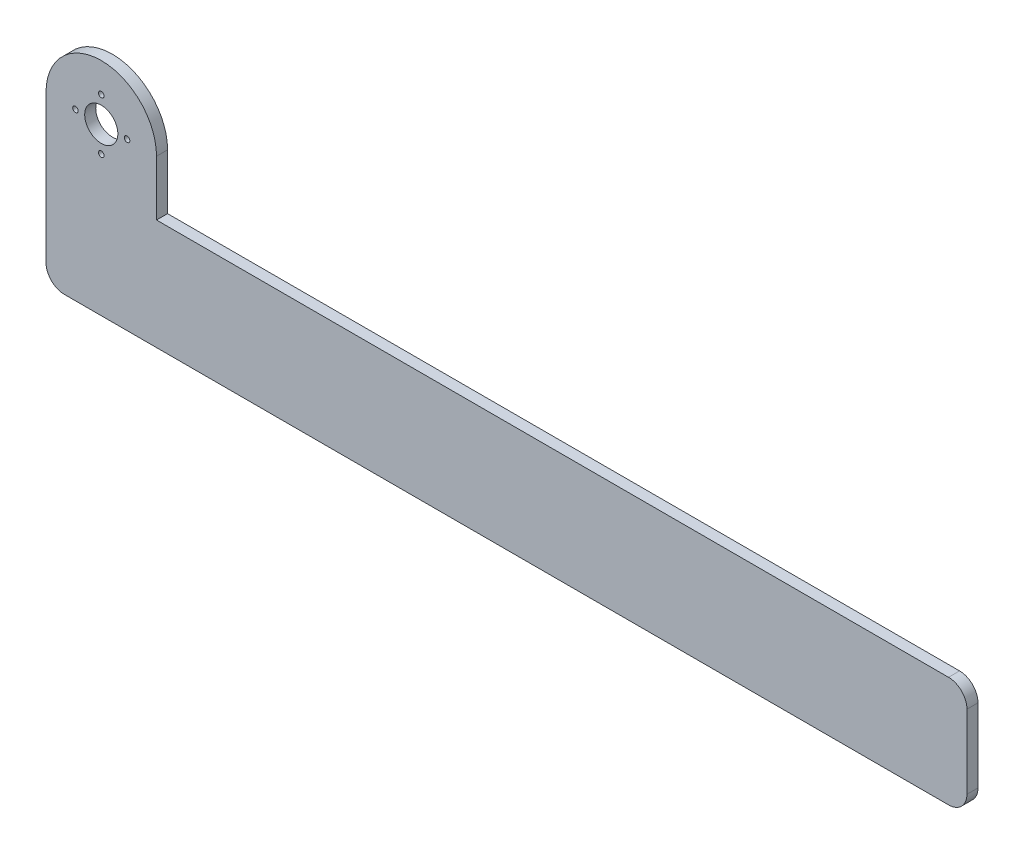
ISO-10303-21;
HEADER;
FILE_DESCRIPTION(('STEP AP214'),'2;1');
FILE_NAME('part.step','',(''),(''),'','','');
FILE_SCHEMA(('AUTOMOTIVE_DESIGN { 1 0 10303 214 1 1 1 1 }'));
ENDSEC;
DATA;
#1=APPLICATION_CONTEXT('core data for automotive mechanical design processes');
#2=APPLICATION_PROTOCOL_DEFINITION('international standard','automotive_design',2000,#1);
#3=PRODUCT_CONTEXT('',#1,'mechanical');
#4=PRODUCT('Part','Part','',(#3));
#5=PRODUCT_RELATED_PRODUCT_CATEGORY('part','',(#4));
#6=PRODUCT_DEFINITION_FORMATION('','',#4);
#7=PRODUCT_DEFINITION_CONTEXT('part definition',#1,'design');
#8=PRODUCT_DEFINITION('design','',#6,#7);
#9=PRODUCT_DEFINITION_SHAPE('','',#8);
#10=(LENGTH_UNIT() NAMED_UNIT(*) SI_UNIT(.MILLI.,.METRE.));
#11=(NAMED_UNIT(*) PLANE_ANGLE_UNIT() SI_UNIT($,.RADIAN.));
#12=(NAMED_UNIT(*) SI_UNIT($,.STERADIAN.) SOLID_ANGLE_UNIT());
#13=UNCERTAINTY_MEASURE_WITH_UNIT(LENGTH_MEASURE(1.E-05),#10,'distance_accuracy_value','');
#14=(GEOMETRIC_REPRESENTATION_CONTEXT(3) GLOBAL_UNCERTAINTY_ASSIGNED_CONTEXT((#13)) GLOBAL_UNIT_ASSIGNED_CONTEXT((#10,
#11,#12)) REPRESENTATION_CONTEXT('',''));
#15=CARTESIAN_POINT('',(0.,0.,0.));
#16=DIRECTION('',(0.,0.,1.));
#17=DIRECTION('',(1.,0.,0.));
#18=AXIS2_PLACEMENT_3D('',#15,#16,#17);
#19=CARTESIAN_POINT('',(-30.,45.,-6.));
#20=DIRECTION('',(-1.,0.,0.));
#21=DIRECTION('',(0.,-1.,0.));
#22=AXIS2_PLACEMENT_3D('',#19,#20,#21);
#23=PLANE('',#22);
#24=DIRECTION('',(0.,-1.,0.));
#25=VECTOR('',#24,1.);
#26=CARTESIAN_POINT('',(-30.,45.,-6.));
#27=LINE('',#26,#25);
#28=CARTESIAN_POINT('',(-30.,45.,-6.));
#29=VERTEX_POINT('',#28);
#30=CARTESIAN_POINT('',(-30.,-35.,-6.));
#31=VERTEX_POINT('',#30);
#32=EDGE_CURVE('E121',#29,#31,#27,.T.);
#33=ORIENTED_EDGE('',*,*,#32,.T.);
#34=DIRECTION('',(0.,0.,1.));
#35=VECTOR('',#34,1.);
#36=CARTESIAN_POINT('',(-30.,-35.,-6.));
#37=LINE('',#36,#35);
#38=CARTESIAN_POINT('',(-30.,-35.,0.));
#39=VERTEX_POINT('',#38);
#40=EDGE_CURVE('E153',#31,#39,#37,.T.);
#41=ORIENTED_EDGE('',*,*,#40,.T.);
#42=DIRECTION('',(0.,-1.,0.));
#43=VECTOR('',#42,1.);
#44=CARTESIAN_POINT('',(-30.,45.,0.));
#45=LINE('',#44,#43);
#46=CARTESIAN_POINT('',(-30.,45.,0.));
#47=VERTEX_POINT('',#46);
#48=EDGE_CURVE('E147',#47,#39,#45,.T.);
#49=ORIENTED_EDGE('',*,*,#48,.F.);
#50=DIRECTION('',(0.,0.,1.));
#51=VECTOR('',#50,1.);
#52=CARTESIAN_POINT('',(-30.,45.,-6.));
#53=LINE('',#52,#51);
#54=EDGE_CURVE('E151',#29,#47,#53,.T.);
#55=ORIENTED_EDGE('',*,*,#54,.F.);
#56=EDGE_LOOP('',(#33,#41,#49,#55));
#57=FACE_BOUND('',#56,.T.);
#58=ADVANCED_FACE('F37',(#57),#23,.T.);
#59=CARTESIAN_POINT('',(0.,45.,-6.));
#60=DIRECTION('',(0.,0.,1.));
#61=DIRECTION('',(1.,0.,0.));
#62=AXIS2_PLACEMENT_3D('',#59,#60,#61);
#63=CYLINDRICAL_SURFACE('',#62,30.);
#64=CARTESIAN_POINT('',(0.,45.,0.));
#65=DIRECTION('',(0.,0.,1.));
#66=DIRECTION('',(-1.,0.,0.));
#67=AXIS2_PLACEMENT_3D('',#64,#65,#66);
#68=CIRCLE('',#67,30.);
#69=CARTESIAN_POINT('',(30.,45.,0.));
#70=VERTEX_POINT('',#69);
#71=EDGE_CURVE('E144',#70,#47,#68,.T.);
#72=ORIENTED_EDGE('',*,*,#71,.F.);
#73=DIRECTION('',(0.,0.,1.));
#74=VECTOR('',#73,1.);
#75=CARTESIAN_POINT('',(30.,45.,-6.));
#76=LINE('',#75,#74);
#77=CARTESIAN_POINT('',(30.,45.,-6.));
#78=VERTEX_POINT('',#77);
#79=EDGE_CURVE('E120',#78,#70,#76,.T.);
#80=ORIENTED_EDGE('',*,*,#79,.F.);
#81=CARTESIAN_POINT('',(0.,45.,-6.));
#82=DIRECTION('',(0.,0.,1.));
#83=DIRECTION('',(-1.,0.,0.));
#84=AXIS2_PLACEMENT_3D('',#81,#82,#83);
#85=CIRCLE('',#84,30.);
#86=EDGE_CURVE('E127',#78,#29,#85,.T.);
#87=ORIENTED_EDGE('',*,*,#86,.T.);
#88=ORIENTED_EDGE('',*,*,#54,.T.);
#89=EDGE_LOOP('',(#72,#80,#87,#88));
#90=FACE_BOUND('',#89,.T.);
#91=ADVANCED_FACE('F212',(#90),#63,.T.);
#92=CARTESIAN_POINT('',(30.,45.,-6.));
#93=DIRECTION('',(1.,0.,0.));
#94=DIRECTION('',(0.,1.,0.));
#95=AXIS2_PLACEMENT_3D('',#92,#93,#94);
#96=PLANE('',#95);
#97=DIRECTION('',(0.,1.,0.));
#98=VECTOR('',#97,1.);
#99=CARTESIAN_POINT('',(30.,45.,0.));
#100=LINE('',#99,#98);
#101=CARTESIAN_POINT('',(30.,15.,0.));
#102=VERTEX_POINT('',#101);
#103=EDGE_CURVE('E119',#102,#70,#100,.T.);
#104=ORIENTED_EDGE('',*,*,#103,.F.);
#105=DIRECTION('',(0.,0.,1.));
#106=VECTOR('',#105,1.);
#107=CARTESIAN_POINT('',(30.,15.,-6.));
#108=LINE('',#107,#106);
#109=CARTESIAN_POINT('',(30.,15.,-6.));
#110=VERTEX_POINT('',#109);
#111=EDGE_CURVE('E109',#110,#102,#108,.T.);
#112=ORIENTED_EDGE('',*,*,#111,.F.);
#113=DIRECTION('',(0.,1.,0.));
#114=VECTOR('',#113,1.);
#115=CARTESIAN_POINT('',(30.,45.,-6.));
#116=LINE('',#115,#114);
#117=EDGE_CURVE('E112',#110,#78,#116,.T.);
#118=ORIENTED_EDGE('',*,*,#117,.T.);
#119=ORIENTED_EDGE('',*,*,#79,.T.);
#120=EDGE_LOOP('',(#104,#112,#118,#119));
#121=FACE_BOUND('',#120,.T.);
#122=ADVANCED_FACE('F117',(#121),#96,.T.);
#123=CARTESIAN_POINT('',(470.,15.,-6.));
#124=DIRECTION('',(0.,1.,0.));
#125=DIRECTION('',(-1.,0.,0.));
#126=AXIS2_PLACEMENT_3D('',#123,#124,#125);
#127=PLANE('',#126);
#128=DIRECTION('',(-1.,0.,0.));
#129=VECTOR('',#128,1.);
#130=CARTESIAN_POINT('',(470.,15.,0.));
#131=LINE('',#130,#129);
#132=CARTESIAN_POINT('',(460.,15.,0.));
#133=VERTEX_POINT('',#132);
#134=EDGE_CURVE('E141',#133,#102,#131,.T.);
#135=ORIENTED_EDGE('',*,*,#134,.F.);
#136=DIRECTION('',(0.,0.,1.));
#137=VECTOR('',#136,1.);
#138=CARTESIAN_POINT('',(460.,15.,-6.));
#139=LINE('',#138,#137);
#140=CARTESIAN_POINT('',(460.,15.,-6.));
#141=VERTEX_POINT('',#140);
#142=EDGE_CURVE('E11',#133,#141,#139,.F.);
#143=ORIENTED_EDGE('',*,*,#142,.T.);
#144=DIRECTION('',(-1.,0.,0.));
#145=VECTOR('',#144,1.);
#146=CARTESIAN_POINT('',(470.,15.,-6.));
#147=LINE('',#146,#145);
#148=EDGE_CURVE('E106',#141,#110,#147,.T.);
#149=ORIENTED_EDGE('',*,*,#148,.T.);
#150=ORIENTED_EDGE('',*,*,#111,.T.);
#151=EDGE_LOOP('',(#135,#143,#149,#150));
#152=FACE_BOUND('',#151,.T.);
#153=ADVANCED_FACE('F108',(#152),#127,.T.);
#154=CARTESIAN_POINT('',(470.,-45.,-6.));
#155=DIRECTION('',(1.,0.,0.));
#156=DIRECTION('',(0.,0.,-1.));
#157=AXIS2_PLACEMENT_3D('',#154,#155,#156);
#158=PLANE('',#157);
#159=DIRECTION('',(0.,1.,0.));
#160=VECTOR('',#159,1.);
#161=CARTESIAN_POINT('',(470.,-45.,0.));
#162=LINE('',#161,#160);
#163=CARTESIAN_POINT('',(470.,-35.,0.));
#164=VERTEX_POINT('',#163);
#165=CARTESIAN_POINT('',(470.,5.00000000000002,0.));
#166=VERTEX_POINT('',#165);
#167=EDGE_CURVE('E137',#164,#166,#162,.T.);
#168=ORIENTED_EDGE('',*,*,#167,.F.);
#169=DIRECTION('',(0.,0.,1.));
#170=VECTOR('',#169,1.);
#171=CARTESIAN_POINT('',(470.,-35.,-6.));
#172=LINE('',#171,#170);
#173=CARTESIAN_POINT('',(470.,-35.,-6.));
#174=VERTEX_POINT('',#173);
#175=EDGE_CURVE('E173',#164,#174,#172,.F.);
#176=ORIENTED_EDGE('',*,*,#175,.T.);
#177=DIRECTION('',(0.,1.,0.));
#178=VECTOR('',#177,1.);
#179=CARTESIAN_POINT('',(470.,-45.,-6.));
#180=LINE('',#179,#178);
#181=CARTESIAN_POINT('',(470.,5.00000000000002,-6.));
#182=VERTEX_POINT('',#181);
#183=EDGE_CURVE('E113',#174,#182,#180,.T.);
#184=ORIENTED_EDGE('',*,*,#183,.T.);
#185=DIRECTION('',(0.,0.,1.));
#186=VECTOR('',#185,1.);
#187=CARTESIAN_POINT('',(470.,5.00000000000002,-6.));
#188=LINE('',#187,#186);
#189=EDGE_CURVE('E170',#182,#166,#188,.T.);
#190=ORIENTED_EDGE('',*,*,#189,.T.);
#191=EDGE_LOOP('',(#168,#176,#184,#190));
#192=FACE_BOUND('',#191,.T.);
#193=ADVANCED_FACE('F192',(#192),#158,.T.);
#194=CARTESIAN_POINT('',(30.,-45.,-6.));
#195=DIRECTION('',(0.,-1.,0.));
#196=DIRECTION('',(1.,0.,0.));
#197=AXIS2_PLACEMENT_3D('',#194,#195,#196);
#198=PLANE('',#197);
#199=DIRECTION('',(1.,0.,0.));
#200=VECTOR('',#199,1.);
#201=CARTESIAN_POINT('',(-30.,-45.,-6.));
#202=LINE('',#201,#200);
#203=CARTESIAN_POINT('',(-20.,-45.,-6.));
#204=VERTEX_POINT('',#203);
#205=CARTESIAN_POINT('',(460.,-45.0000000000001,-6.));
#206=VERTEX_POINT('',#205);
#207=EDGE_CURVE('E150',#204,#206,#202,.T.);
#208=ORIENTED_EDGE('',*,*,#207,.T.);
#209=DIRECTION('',(0.,0.,1.));
#210=VECTOR('',#209,1.);
#211=CARTESIAN_POINT('',(460.,-45.,-6.));
#212=LINE('',#211,#210);
#213=CARTESIAN_POINT('',(460.,-45.,0.));
#214=VERTEX_POINT('',#213);
#215=EDGE_CURVE('E163',#206,#214,#212,.T.);
#216=ORIENTED_EDGE('',*,*,#215,.T.);
#217=DIRECTION('',(1.,0.,0.));
#218=VECTOR('',#217,1.);
#219=CARTESIAN_POINT('',(30.,-45.,0.));
#220=LINE('',#219,#218);
#221=CARTESIAN_POINT('',(-20.,-45.,0.));
#222=VERTEX_POINT('',#221);
#223=EDGE_CURVE('E134',#222,#214,#220,.T.);
#224=ORIENTED_EDGE('',*,*,#223,.F.);
#225=DIRECTION('',(0.,0.,1.));
#226=VECTOR('',#225,1.);
#227=CARTESIAN_POINT('',(-20.,-45.,-6.));
#228=LINE('',#227,#226);
#229=EDGE_CURVE('E159',#222,#204,#228,.F.);
#230=ORIENTED_EDGE('',*,*,#229,.T.);
#231=EDGE_LOOP('',(#208,#216,#224,#230));
#232=FACE_BOUND('',#231,.T.);
#233=ADVANCED_FACE('F183',(#232),#198,.T.);
#234=CARTESIAN_POINT('',(0.,45.,-6.));
#235=DIRECTION('',(0.,0.,-1.));
#236=DIRECTION('',(-1.,0.,0.));
#237=AXIS2_PLACEMENT_3D('',#234,#235,#236);
#238=PLANE('',#237);
#239=CARTESIAN_POINT('',(0.,31.,-6.));
#240=DIRECTION('',(0.,0.,-1.));
#241=DIRECTION('',(-1.,0.,0.));
#242=AXIS2_PLACEMENT_3D('',#239,#240,#241);
#243=CIRCLE('',#242,1.5);
#244=CARTESIAN_POINT('',(-1.5,31.,-6.));
#245=VERTEX_POINT('',#244);
#246=EDGE_CURVE('E261',#245,#245,#243,.T.);
#247=ORIENTED_EDGE('',*,*,#246,.F.);
#248=EDGE_LOOP('',(#247));
#249=FACE_BOUND('',#248,.T.);
#250=CARTESIAN_POINT('',(-14.,45.,-6.));
#251=DIRECTION('',(0.,0.,-1.));
#252=DIRECTION('',(-1.,0.,0.));
#253=AXIS2_PLACEMENT_3D('',#250,#251,#252);
#254=CIRCLE('',#253,1.5);
#255=CARTESIAN_POINT('',(-15.5,45.,-6.));
#256=VERTEX_POINT('',#255);
#257=EDGE_CURVE('E262',#256,#256,#254,.T.);
#258=ORIENTED_EDGE('',*,*,#257,.F.);
#259=EDGE_LOOP('',(#258));
#260=FACE_BOUND('',#259,.T.);
#261=CARTESIAN_POINT('',(0.,59.,-6.));
#262=DIRECTION('',(0.,0.,-1.));
#263=DIRECTION('',(-1.,0.,0.));
#264=AXIS2_PLACEMENT_3D('',#261,#262,#263);
#265=CIRCLE('',#264,1.5);
#266=CARTESIAN_POINT('',(-1.5,59.,-6.));
#267=VERTEX_POINT('',#266);
#268=EDGE_CURVE('E272',#267,#267,#265,.T.);
#269=ORIENTED_EDGE('',*,*,#268,.F.);
#270=EDGE_LOOP('',(#269));
#271=FACE_BOUND('',#270,.T.);
#272=CARTESIAN_POINT('',(14.,45.,-6.));
#273=DIRECTION('',(0.,0.,-1.));
#274=DIRECTION('',(-1.,0.,0.));
#275=AXIS2_PLACEMENT_3D('',#272,#273,#274);
#276=CIRCLE('',#275,1.5);
#277=CARTESIAN_POINT('',(12.5,45.,-6.));
#278=VERTEX_POINT('',#277);
#279=EDGE_CURVE('E278',#278,#278,#276,.T.);
#280=ORIENTED_EDGE('',*,*,#279,.F.);
#281=EDGE_LOOP('',(#280));
#282=FACE_BOUND('',#281,.T.);
#283=CARTESIAN_POINT('',(0.,45.,-6.));
#284=DIRECTION('',(0.,0.,-1.));
#285=DIRECTION('',(-1.,0.,0.));
#286=AXIS2_PLACEMENT_3D('',#283,#284,#285);
#287=CIRCLE('',#286,9.);
#288=CARTESIAN_POINT('',(-8.99999999999999,45.,-6.));
#289=VERTEX_POINT('',#288);
#290=EDGE_CURVE('E264',#289,#289,#287,.T.);
#291=ORIENTED_EDGE('',*,*,#290,.F.);
#292=EDGE_LOOP('',(#291));
#293=FACE_BOUND('',#292,.T.);
#294=ORIENTED_EDGE('',*,*,#183,.F.);
#295=CARTESIAN_POINT('',(460.,-35.,-6.));
#296=DIRECTION('',(0.,0.,-1.));
#297=DIRECTION('',(-1.,0.,0.));
#298=AXIS2_PLACEMENT_3D('',#295,#296,#297);
#299=CIRCLE('',#298,10.);
#300=EDGE_CURVE('E45',#174,#206,#299,.T.);
#301=ORIENTED_EDGE('',*,*,#300,.T.);
#302=ORIENTED_EDGE('',*,*,#207,.F.);
#303=CARTESIAN_POINT('',(-20.,-35.,-6.));
#304=DIRECTION('',(0.,0.,-1.));
#305=DIRECTION('',(-1.,0.,0.));
#306=AXIS2_PLACEMENT_3D('',#303,#304,#305);
#307=CIRCLE('',#306,10.);
#308=EDGE_CURVE('E161',#204,#31,#307,.T.);
#309=ORIENTED_EDGE('',*,*,#308,.T.);
#310=ORIENTED_EDGE('',*,*,#32,.F.);
#311=ORIENTED_EDGE('',*,*,#86,.F.);
#312=ORIENTED_EDGE('',*,*,#117,.F.);
#313=ORIENTED_EDGE('',*,*,#148,.F.);
#314=CARTESIAN_POINT('',(460.,5.00000000000002,-6.));
#315=DIRECTION('',(0.,0.,-1.));
#316=DIRECTION('',(-1.,0.,0.));
#317=AXIS2_PLACEMENT_3D('',#314,#315,#316);
#318=CIRCLE('',#317,10.);
#319=EDGE_CURVE('E57',#141,#182,#318,.T.);
#320=ORIENTED_EDGE('',*,*,#319,.T.);
#321=EDGE_LOOP('',(#294,#301,#302,#309,#310,#311,#312,#313,#320));
#322=FACE_BOUND('',#321,.T.);
#323=ADVANCED_FACE('F124',(#249,#260,#271,#282,#293,#322),#238,.T.);
#324=CARTESIAN_POINT('',(0.,45.,0.));
#325=DIRECTION('',(0.,0.,-1.));
#326=DIRECTION('',(-1.,0.,0.));
#327=AXIS2_PLACEMENT_3D('',#324,#325,#326);
#328=PLANE('',#327);
#329=CARTESIAN_POINT('',(0.,31.,0.));
#330=DIRECTION('',(0.,0.,-1.));
#331=DIRECTION('',(-1.,0.,0.));
#332=AXIS2_PLACEMENT_3D('',#329,#330,#331);
#333=CIRCLE('',#332,1.5);
#334=CARTESIAN_POINT('',(-1.5,31.,0.));
#335=VERTEX_POINT('',#334);
#336=EDGE_CURVE('E259',#335,#335,#333,.T.);
#337=ORIENTED_EDGE('',*,*,#336,.T.);
#338=EDGE_LOOP('',(#337));
#339=FACE_BOUND('',#338,.T.);
#340=CARTESIAN_POINT('',(-14.,45.,0.));
#341=DIRECTION('',(0.,0.,-1.));
#342=DIRECTION('',(-1.,0.,0.));
#343=AXIS2_PLACEMENT_3D('',#340,#341,#342);
#344=CIRCLE('',#343,1.5);
#345=CARTESIAN_POINT('',(-15.5,45.,0.));
#346=VERTEX_POINT('',#345);
#347=EDGE_CURVE('E267',#346,#346,#344,.T.);
#348=ORIENTED_EDGE('',*,*,#347,.T.);
#349=EDGE_LOOP('',(#348));
#350=FACE_BOUND('',#349,.T.);
#351=CARTESIAN_POINT('',(0.,59.,0.));
#352=DIRECTION('',(0.,0.,-1.));
#353=DIRECTION('',(-1.,0.,0.));
#354=AXIS2_PLACEMENT_3D('',#351,#352,#353);
#355=CIRCLE('',#354,1.5);
#356=CARTESIAN_POINT('',(-1.5,59.,0.));
#357=VERTEX_POINT('',#356);
#358=EDGE_CURVE('E275',#357,#357,#355,.T.);
#359=ORIENTED_EDGE('',*,*,#358,.T.);
#360=EDGE_LOOP('',(#359));
#361=FACE_BOUND('',#360,.T.);
#362=CARTESIAN_POINT('',(14.,45.,0.));
#363=DIRECTION('',(0.,0.,-1.));
#364=DIRECTION('',(-1.,0.,0.));
#365=AXIS2_PLACEMENT_3D('',#362,#363,#364);
#366=CIRCLE('',#365,1.5);
#367=CARTESIAN_POINT('',(12.5,45.,0.));
#368=VERTEX_POINT('',#367);
#369=EDGE_CURVE('E281',#368,#368,#366,.T.);
#370=ORIENTED_EDGE('',*,*,#369,.T.);
#371=EDGE_LOOP('',(#370));
#372=FACE_BOUND('',#371,.T.);
#373=CARTESIAN_POINT('',(0.,45.,0.));
#374=DIRECTION('',(0.,0.,-1.));
#375=DIRECTION('',(-1.,0.,0.));
#376=AXIS2_PLACEMENT_3D('',#373,#374,#375);
#377=CIRCLE('',#376,9.);
#378=CARTESIAN_POINT('',(-8.99999999999999,45.,0.));
#379=VERTEX_POINT('',#378);
#380=EDGE_CURVE('E138',#379,#379,#377,.T.);
#381=ORIENTED_EDGE('',*,*,#380,.T.);
#382=EDGE_LOOP('',(#381));
#383=FACE_BOUND('',#382,.T.);
#384=ORIENTED_EDGE('',*,*,#223,.T.);
#385=CARTESIAN_POINT('',(460.,-35.,0.));
#386=DIRECTION('',(0.,0.,-1.));
#387=DIRECTION('',(-1.,0.,0.));
#388=AXIS2_PLACEMENT_3D('',#385,#386,#387);
#389=CIRCLE('',#388,10.);
#390=EDGE_CURVE('E168',#214,#164,#389,.F.);
#391=ORIENTED_EDGE('',*,*,#390,.T.);
#392=ORIENTED_EDGE('',*,*,#167,.T.);
#393=CARTESIAN_POINT('',(460.,5.00000000000002,0.));
#394=DIRECTION('',(0.,0.,-1.));
#395=DIRECTION('',(-1.,0.,0.));
#396=AXIS2_PLACEMENT_3D('',#393,#394,#395);
#397=CIRCLE('',#396,10.);
#398=EDGE_CURVE('E166',#166,#133,#397,.F.);
#399=ORIENTED_EDGE('',*,*,#398,.T.);
#400=ORIENTED_EDGE('',*,*,#134,.T.);
#401=ORIENTED_EDGE('',*,*,#103,.T.);
#402=ORIENTED_EDGE('',*,*,#71,.T.);
#403=ORIENTED_EDGE('',*,*,#48,.T.);
#404=CARTESIAN_POINT('',(-20.,-35.,0.));
#405=DIRECTION('',(0.,0.,-1.));
#406=DIRECTION('',(-1.,0.,0.));
#407=AXIS2_PLACEMENT_3D('',#404,#405,#406);
#408=CIRCLE('',#407,10.);
#409=EDGE_CURVE('E157',#39,#222,#408,.F.);
#410=ORIENTED_EDGE('',*,*,#409,.T.);
#411=EDGE_LOOP('',(#384,#391,#392,#399,#400,#401,#402,#403,#410));
#412=FACE_BOUND('',#411,.T.);
#413=ADVANCED_FACE('F190',(#339,#350,#361,#372,#383,#412),#328,.F.);
#414=CARTESIAN_POINT('',(-20.,-35.,-6.));
#415=DIRECTION('',(0.,0.,1.));
#416=DIRECTION('',(1.,0.,0.));
#417=AXIS2_PLACEMENT_3D('',#414,#415,#416);
#418=CYLINDRICAL_SURFACE('',#417,10.);
#419=ORIENTED_EDGE('',*,*,#308,.F.);
#420=ORIENTED_EDGE('',*,*,#229,.F.);
#421=ORIENTED_EDGE('',*,*,#409,.F.);
#422=ORIENTED_EDGE('',*,*,#40,.F.);
#423=EDGE_LOOP('',(#419,#420,#421,#422));
#424=FACE_BOUND('',#423,.T.);
#425=ADVANCED_FACE('F201',(#424),#418,.T.);
#426=CARTESIAN_POINT('',(460.,-35.,-6.));
#427=DIRECTION('',(0.,0.,1.));
#428=DIRECTION('',(1.,0.,0.));
#429=AXIS2_PLACEMENT_3D('',#426,#427,#428);
#430=CYLINDRICAL_SURFACE('',#429,10.);
#431=ORIENTED_EDGE('',*,*,#300,.F.);
#432=ORIENTED_EDGE('',*,*,#175,.F.);
#433=ORIENTED_EDGE('',*,*,#390,.F.);
#434=ORIENTED_EDGE('',*,*,#215,.F.);
#435=EDGE_LOOP('',(#431,#432,#433,#434));
#436=FACE_BOUND('',#435,.T.);
#437=ADVANCED_FACE('F187',(#436),#430,.T.);
#438=CARTESIAN_POINT('',(460.,5.00000000000002,-6.));
#439=DIRECTION('',(0.,0.,1.));
#440=DIRECTION('',(1.,0.,0.));
#441=AXIS2_PLACEMENT_3D('',#438,#439,#440);
#442=CYLINDRICAL_SURFACE('',#441,10.);
#443=ORIENTED_EDGE('',*,*,#319,.F.);
#444=ORIENTED_EDGE('',*,*,#142,.F.);
#445=ORIENTED_EDGE('',*,*,#398,.F.);
#446=ORIENTED_EDGE('',*,*,#189,.F.);
#447=EDGE_LOOP('',(#443,#444,#445,#446));
#448=FACE_BOUND('',#447,.T.);
#449=ADVANCED_FACE('F39',(#448),#442,.T.);
#450=CARTESIAN_POINT('',(0.,45.,0.));
#451=DIRECTION('',(0.,0.,-1.));
#452=DIRECTION('',(-1.,0.,0.));
#453=AXIS2_PLACEMENT_3D('',#450,#451,#452);
#454=CYLINDRICAL_SURFACE('',#453,9.);
#455=ORIENTED_EDGE('',*,*,#380,.F.);
#456=EDGE_LOOP('',(#455));
#457=FACE_BOUND('',#456,.T.);
#458=ORIENTED_EDGE('',*,*,#290,.T.);
#459=EDGE_LOOP('',(#458));
#460=FACE_BOUND('',#459,.T.);
#461=ADVANCED_FACE('F235',(#457,#460),#454,.F.);
#462=CARTESIAN_POINT('',(14.,45.,0.));
#463=DIRECTION('',(0.,0.,-1.));
#464=DIRECTION('',(-1.,0.,0.));
#465=AXIS2_PLACEMENT_3D('',#462,#463,#464);
#466=CYLINDRICAL_SURFACE('',#465,1.5);
#467=ORIENTED_EDGE('',*,*,#369,.F.);
#468=EDGE_LOOP('',(#467));
#469=FACE_BOUND('',#468,.T.);
#470=ORIENTED_EDGE('',*,*,#279,.T.);
#471=EDGE_LOOP('',(#470));
#472=FACE_BOUND('',#471,.T.);
#473=ADVANCED_FACE('F238',(#469,#472),#466,.F.);
#474=CARTESIAN_POINT('',(0.,59.,0.));
#475=DIRECTION('',(0.,0.,-1.));
#476=DIRECTION('',(-1.,0.,0.));
#477=AXIS2_PLACEMENT_3D('',#474,#475,#476);
#478=CYLINDRICAL_SURFACE('',#477,1.5);
#479=ORIENTED_EDGE('',*,*,#358,.F.);
#480=EDGE_LOOP('',(#479));
#481=FACE_BOUND('',#480,.T.);
#482=ORIENTED_EDGE('',*,*,#268,.T.);
#483=EDGE_LOOP('',(#482));
#484=FACE_BOUND('',#483,.T.);
#485=ADVANCED_FACE('F242',(#481,#484),#478,.F.);
#486=CARTESIAN_POINT('',(-14.,45.,0.));
#487=DIRECTION('',(0.,0.,-1.));
#488=DIRECTION('',(-1.,0.,0.));
#489=AXIS2_PLACEMENT_3D('',#486,#487,#488);
#490=CYLINDRICAL_SURFACE('',#489,1.5);
#491=ORIENTED_EDGE('',*,*,#347,.F.);
#492=EDGE_LOOP('',(#491));
#493=FACE_BOUND('',#492,.T.);
#494=ORIENTED_EDGE('',*,*,#257,.T.);
#495=EDGE_LOOP('',(#494));
#496=FACE_BOUND('',#495,.T.);
#497=ADVANCED_FACE('F246',(#493,#496),#490,.F.);
#498=CARTESIAN_POINT('',(0.,31.,0.));
#499=DIRECTION('',(0.,0.,-1.));
#500=DIRECTION('',(-1.,0.,0.));
#501=AXIS2_PLACEMENT_3D('',#498,#499,#500);
#502=CYLINDRICAL_SURFACE('',#501,1.5);
#503=ORIENTED_EDGE('',*,*,#336,.F.);
#504=EDGE_LOOP('',(#503));
#505=FACE_BOUND('',#504,.T.);
#506=ORIENTED_EDGE('',*,*,#246,.T.);
#507=EDGE_LOOP('',(#506));
#508=FACE_BOUND('',#507,.T.);
#509=ADVANCED_FACE('F250',(#505,#508),#502,.F.);
#510=CLOSED_SHELL('',(#58,#91,#122,#153,#193,#233,#323,#413,#425,#437,#449,#461,#473,#485,#497,#509));
#511=MANIFOLD_SOLID_BREP('B2',#510);
#512=ADVANCED_BREP_SHAPE_REPRESENTATION('',(#18,#511),#14);
#513=SHAPE_DEFINITION_REPRESENTATION(#9,#512);
ENDSEC;
END-ISO-10303-21;
